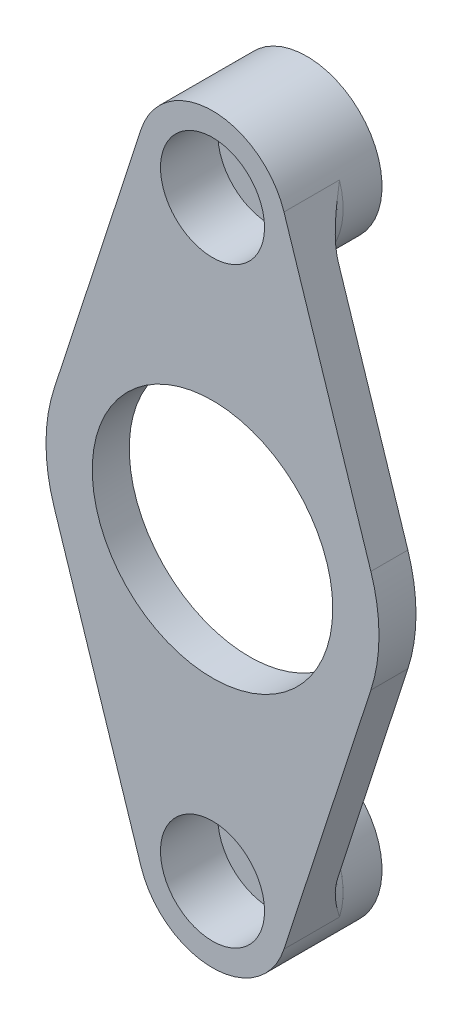
ISO-10303-21;
HEADER;
FILE_DESCRIPTION(('STEP AP214'),'2;1');
FILE_NAME('part.step','',(''),(''),'','','');
FILE_SCHEMA(('AUTOMOTIVE_DESIGN { 1 0 10303 214 1 1 1 1 }'));
ENDSEC;
DATA;
#1=APPLICATION_CONTEXT('core data for automotive mechanical design processes');
#2=APPLICATION_PROTOCOL_DEFINITION('international standard','automotive_design',2000,#1);
#3=PRODUCT_CONTEXT('',#1,'mechanical');
#4=PRODUCT('Part','Part','',(#3));
#5=PRODUCT_RELATED_PRODUCT_CATEGORY('part','',(#4));
#6=PRODUCT_DEFINITION_FORMATION('','',#4);
#7=PRODUCT_DEFINITION_CONTEXT('part definition',#1,'design');
#8=PRODUCT_DEFINITION('design','',#6,#7);
#9=PRODUCT_DEFINITION_SHAPE('','',#8);
#10=(LENGTH_UNIT() NAMED_UNIT(*) SI_UNIT(.MILLI.,.METRE.));
#11=(NAMED_UNIT(*) PLANE_ANGLE_UNIT() SI_UNIT($,.RADIAN.));
#12=(NAMED_UNIT(*) SI_UNIT($,.STERADIAN.) SOLID_ANGLE_UNIT());
#13=UNCERTAINTY_MEASURE_WITH_UNIT(LENGTH_MEASURE(1.E-05),#10,'distance_accuracy_value','');
#14=(GEOMETRIC_REPRESENTATION_CONTEXT(3) GLOBAL_UNCERTAINTY_ASSIGNED_CONTEXT((#13)) GLOBAL_UNIT_ASSIGNED_CONTEXT((#10,
#11,#12)) REPRESENTATION_CONTEXT('',''));
#15=CARTESIAN_POINT('',(0.,0.,0.));
#16=DIRECTION('',(0.,0.,1.));
#17=DIRECTION('',(1.,0.,0.));
#18=AXIS2_PLACEMENT_3D('',#15,#16,#17);
#19=CARTESIAN_POINT('',(0.,20.32,2.54));
#20=DIRECTION('',(0.,0.,1.));
#21=DIRECTION('',(1.,0.,0.));
#22=AXIS2_PLACEMENT_3D('',#19,#20,#21);
#23=PLANE('',#22);
#24=DIRECTION('',(0.30859375,-0.951193932624119,0.));
#25=VECTOR('',#24,1.);
#26=CARTESIAN_POINT('',(-4.90756619613257,-21.9121508789063,2.54));
#27=LINE('',#26,#25);
#28=CARTESIAN_POINT('',(-10.8721466498937,-3.52722656249999,2.54));
#29=VERTEX_POINT('',#28);
#30=CARTESIAN_POINT('',(-4.90756619613257,-21.9121508789063,2.54));
#31=VERTEX_POINT('',#30);
#32=EDGE_CURVE('E295',#29,#31,#27,.T.);
#33=ORIENTED_EDGE('',*,*,#32,.T.);
#34=CARTESIAN_POINT('',(0.,-20.32,2.54));
#35=DIRECTION('',(0.,0.,1.));
#36=DIRECTION('',(-1.,0.,0.));
#37=AXIS2_PLACEMENT_3D('',#34,#35,#36);
#38=CIRCLE('',#37,5.159375);
#39=CARTESIAN_POINT('',(4.90756619613257,-21.9121508789063,2.54));
#40=VERTEX_POINT('',#39);
#41=EDGE_CURVE('E292',#31,#40,#38,.T.);
#42=ORIENTED_EDGE('',*,*,#41,.T.);
#43=DIRECTION('',(0.30859375,0.951193932624119,0.));
#44=VECTOR('',#43,1.);
#45=CARTESIAN_POINT('',(4.90756619613257,-21.9121508789063,2.54));
#46=LINE('',#45,#44);
#47=CARTESIAN_POINT('',(10.8721466498937,-3.5272265625,2.54));
#48=VERTEX_POINT('',#47);
#49=EDGE_CURVE('E289',#40,#48,#46,.T.);
#50=ORIENTED_EDGE('',*,*,#49,.T.);
#51=CARTESIAN_POINT('',(0.,0.,2.54));
#52=DIRECTION('',(0.,0.,1.));
#53=DIRECTION('',(1.,0.,0.));
#54=AXIS2_PLACEMENT_3D('',#51,#52,#53);
#55=CIRCLE('',#54,11.43);
#56=CARTESIAN_POINT('',(10.8721466498937,3.5272265625,2.54));
#57=VERTEX_POINT('',#56);
#58=EDGE_CURVE('E286',#48,#57,#55,.T.);
#59=ORIENTED_EDGE('',*,*,#58,.T.);
#60=DIRECTION('',(-0.30859375,0.951193932624119,0.));
#61=VECTOR('',#60,1.);
#62=CARTESIAN_POINT('',(4.90756619613257,21.9121508789063,2.54));
#63=LINE('',#62,#61);
#64=CARTESIAN_POINT('',(4.90756619613257,21.9121508789063,2.54));
#65=VERTEX_POINT('',#64);
#66=EDGE_CURVE('E139',#57,#65,#63,.T.);
#67=ORIENTED_EDGE('',*,*,#66,.T.);
#68=CARTESIAN_POINT('',(0.,20.32,2.54));
#69=DIRECTION('',(0.,0.,1.));
#70=DIRECTION('',(1.,0.,0.));
#71=AXIS2_PLACEMENT_3D('',#68,#69,#70);
#72=CIRCLE('',#71,5.159375);
#73=CARTESIAN_POINT('',(-4.90756619613257,21.9121508789063,2.54));
#74=VERTEX_POINT('',#73);
#75=EDGE_CURVE('E135',#65,#74,#72,.T.);
#76=ORIENTED_EDGE('',*,*,#75,.T.);
#77=DIRECTION('',(-0.30859375,-0.951193932624119,0.));
#78=VECTOR('',#77,1.);
#79=CARTESIAN_POINT('',(-4.90756619613257,21.9121508789063,2.54));
#80=LINE('',#79,#78);
#81=CARTESIAN_POINT('',(-10.8721466498937,3.5272265625,2.54));
#82=VERTEX_POINT('',#81);
#83=EDGE_CURVE('E126',#74,#82,#80,.T.);
#84=ORIENTED_EDGE('',*,*,#83,.T.);
#85=CARTESIAN_POINT('',(0.,0.,2.54));
#86=DIRECTION('',(0.,0.,1.));
#87=DIRECTION('',(1.,0.,0.));
#88=AXIS2_PLACEMENT_3D('',#85,#86,#87);
#89=CIRCLE('',#88,11.43);
#90=EDGE_CURVE('E134',#82,#29,#89,.T.);
#91=ORIENTED_EDGE('',*,*,#90,.T.);
#92=EDGE_LOOP('',(#33,#42,#50,#59,#67,#76,#84,#91));
#93=FACE_BOUND('',#92,.T.);
#94=CARTESIAN_POINT('',(0.,0.,2.54));
#95=DIRECTION('',(0.,0.,1.));
#96=DIRECTION('',(1.,0.,0.));
#97=AXIS2_PLACEMENT_3D('',#94,#95,#96);
#98=CIRCLE('',#97,8.255);
#99=CARTESIAN_POINT('',(8.255,0.,2.54));
#100=VERTEX_POINT('',#99);
#101=EDGE_CURVE('E301',#100,#100,#98,.T.);
#102=ORIENTED_EDGE('',*,*,#101,.F.);
#103=EDGE_LOOP('',(#102));
#104=FACE_BOUND('',#103,.T.);
#105=CARTESIAN_POINT('',(0.,20.32,2.54));
#106=DIRECTION('',(0.,0.,1.));
#107=DIRECTION('',(1.,0.,0.));
#108=AXIS2_PLACEMENT_3D('',#105,#106,#107);
#109=CIRCLE('',#108,3.571875);
#110=CARTESIAN_POINT('',(3.571875,20.32,2.54));
#111=VERTEX_POINT('',#110);
#112=EDGE_CURVE('E311',#111,#111,#109,.T.);
#113=ORIENTED_EDGE('',*,*,#112,.F.);
#114=EDGE_LOOP('',(#113));
#115=FACE_BOUND('',#114,.T.);
#116=CARTESIAN_POINT('',(0.,-20.32,2.54));
#117=DIRECTION('',(0.,0.,1.));
#118=DIRECTION('',(1.,0.,0.));
#119=AXIS2_PLACEMENT_3D('',#116,#117,#118);
#120=CIRCLE('',#119,3.571875);
#121=CARTESIAN_POINT('',(3.571875,-20.32,2.54));
#122=VERTEX_POINT('',#121);
#123=EDGE_CURVE('E317',#122,#122,#120,.T.);
#124=ORIENTED_EDGE('',*,*,#123,.F.);
#125=EDGE_LOOP('',(#124));
#126=FACE_BOUND('',#125,.T.);
#127=ADVANCED_FACE('F44',(#93,#104,#115,#126),#23,.T.);
#128=CARTESIAN_POINT('',(0.,20.32,0.));
#129=DIRECTION('',(0.,0.,1.));
#130=DIRECTION('',(1.,0.,0.));
#131=AXIS2_PLACEMENT_3D('',#128,#129,#130);
#132=PLANE('',#131);
#133=DIRECTION('',(0.30859375,0.951193932624119,0.));
#134=VECTOR('',#133,1.);
#135=CARTESIAN_POINT('',(4.90756619613257,-21.9121508789063,0.));
#136=LINE('',#135,#134);
#137=CARTESIAN_POINT('',(6.09144510485399,-18.263021773286,0.));
#138=VERTEX_POINT('',#137);
#139=CARTESIAN_POINT('',(10.8721466498937,-3.5272265625,0.));
#140=VERTEX_POINT('',#139);
#141=EDGE_CURVE('E236',#138,#140,#136,.T.);
#142=ORIENTED_EDGE('',*,*,#141,.F.);
#143=CARTESIAN_POINT('',(0.,-20.32,0.));
#144=DIRECTION('',(0.,0.,1.));
#145=DIRECTION('',(1.,0.,0.));
#146=AXIS2_PLACEMENT_3D('',#143,#144,#145);
#147=CIRCLE('',#146,6.429375);
#148=CARTESIAN_POINT('',(-6.09144510485399,-18.263021773286,0.));
#149=VERTEX_POINT('',#148);
#150=EDGE_CURVE('E154',#138,#149,#147,.T.);
#151=ORIENTED_EDGE('',*,*,#150,.T.);
#152=DIRECTION('',(0.30859375,-0.951193932624119,0.));
#153=VECTOR('',#152,1.);
#154=CARTESIAN_POINT('',(-4.90756619613257,-21.9121508789063,0.));
#155=LINE('',#154,#153);
#156=CARTESIAN_POINT('',(-10.8721466498937,-3.52722656249999,0.));
#157=VERTEX_POINT('',#156);
#158=EDGE_CURVE('E250',#157,#149,#155,.T.);
#159=ORIENTED_EDGE('',*,*,#158,.F.);
#160=CARTESIAN_POINT('',(0.,0.,0.));
#161=DIRECTION('',(0.,0.,1.));
#162=DIRECTION('',(1.,0.,0.));
#163=AXIS2_PLACEMENT_3D('',#160,#161,#162);
#164=CIRCLE('',#163,11.43);
#165=CARTESIAN_POINT('',(-10.8721466498937,3.5272265625,0.));
#166=VERTEX_POINT('',#165);
#167=EDGE_CURVE('E260',#166,#157,#164,.T.);
#168=ORIENTED_EDGE('',*,*,#167,.F.);
#169=DIRECTION('',(-0.30859375,-0.951193932624119,0.));
#170=VECTOR('',#169,1.);
#171=CARTESIAN_POINT('',(-4.90756619613257,21.9121508789063,0.));
#172=LINE('',#171,#170);
#173=CARTESIAN_POINT('',(-6.09144510485399,18.263021773286,0.));
#174=VERTEX_POINT('',#173);
#175=EDGE_CURVE('E263',#174,#166,#172,.T.);
#176=ORIENTED_EDGE('',*,*,#175,.F.);
#177=CARTESIAN_POINT('',(0.,20.32,0.));
#178=DIRECTION('',(0.,0.,1.));
#179=DIRECTION('',(1.,0.,0.));
#180=AXIS2_PLACEMENT_3D('',#177,#178,#179);
#181=CIRCLE('',#180,6.429375);
#182=CARTESIAN_POINT('',(6.09144510485399,18.263021773286,0.));
#183=VERTEX_POINT('',#182);
#184=EDGE_CURVE('E149',#174,#183,#181,.T.);
#185=ORIENTED_EDGE('',*,*,#184,.T.);
#186=DIRECTION('',(-0.30859375,0.951193932624119,0.));
#187=VECTOR('',#186,1.);
#188=CARTESIAN_POINT('',(4.90756619613257,21.9121508789063,0.));
#189=LINE('',#188,#187);
#190=CARTESIAN_POINT('',(10.8721466498937,3.5272265625,0.));
#191=VERTEX_POINT('',#190);
#192=EDGE_CURVE('E141',#191,#183,#189,.T.);
#193=ORIENTED_EDGE('',*,*,#192,.F.);
#194=CARTESIAN_POINT('',(0.,0.,0.));
#195=DIRECTION('',(0.,0.,1.));
#196=DIRECTION('',(1.,0.,0.));
#197=AXIS2_PLACEMENT_3D('',#194,#195,#196);
#198=CIRCLE('',#197,11.43);
#199=EDGE_CURVE('E248',#140,#191,#198,.T.);
#200=ORIENTED_EDGE('',*,*,#199,.F.);
#201=EDGE_LOOP('',(#142,#151,#159,#168,#176,#185,#193,#200));
#202=FACE_BOUND('',#201,.T.);
#203=CARTESIAN_POINT('',(0.,0.,0.));
#204=DIRECTION('',(0.,0.,1.));
#205=DIRECTION('',(1.,0.,0.));
#206=AXIS2_PLACEMENT_3D('',#203,#204,#205);
#207=CIRCLE('',#206,8.255);
#208=CARTESIAN_POINT('',(8.255,0.,0.));
#209=VERTEX_POINT('',#208);
#210=EDGE_CURVE('E305',#209,#209,#207,.T.);
#211=ORIENTED_EDGE('',*,*,#210,.T.);
#212=EDGE_LOOP('',(#211));
#213=FACE_BOUND('',#212,.T.);
#214=ADVANCED_FACE('F196',(#202,#213),#132,.F.);
#215=CARTESIAN_POINT('',(0.,20.32,2.54));
#216=DIRECTION('',(0.,0.,-1.));
#217=DIRECTION('',(-1.,0.,0.));
#218=AXIS2_PLACEMENT_3D('',#215,#216,#217);
#219=CYLINDRICAL_SURFACE('',#218,5.159375);
#220=DIRECTION('',(0.,0.,-1.));
#221=VECTOR('',#220,1.);
#222=CARTESIAN_POINT('',(4.90756619613257,21.9121508789063,2.54));
#223=LINE('',#222,#221);
#224=CARTESIAN_POINT('',(4.90756619613257,21.9121508789063,-1.27));
#225=VERTEX_POINT('',#224);
#226=EDGE_CURVE('E66',#65,#225,#223,.T.);
#227=ORIENTED_EDGE('',*,*,#226,.T.);
#228=CARTESIAN_POINT('',(0.,20.32,-1.27));
#229=DIRECTION('',(0.,0.,1.));
#230=DIRECTION('',(1.,0.,0.));
#231=AXIS2_PLACEMENT_3D('',#228,#229,#230);
#232=CIRCLE('',#231,5.159375);
#233=CARTESIAN_POINT('',(-4.90756619613257,21.9121508789063,-1.27));
#234=VERTEX_POINT('',#233);
#235=EDGE_CURVE('E146',#225,#234,#232,.F.);
#236=ORIENTED_EDGE('',*,*,#235,.T.);
#237=DIRECTION('',(0.,0.,-1.));
#238=VECTOR('',#237,1.);
#239=CARTESIAN_POINT('',(-4.90756619613257,21.9121508789063,2.54));
#240=LINE('',#239,#238);
#241=EDGE_CURVE('E73',#74,#234,#240,.T.);
#242=ORIENTED_EDGE('',*,*,#241,.F.);
#243=ORIENTED_EDGE('',*,*,#75,.F.);
#244=EDGE_LOOP('',(#227,#236,#242,#243));
#245=FACE_BOUND('',#244,.T.);
#246=CARTESIAN_POINT('',(0.,20.32,-3.937));
#247=DIRECTION('',(0.,0.,-1.));
#248=DIRECTION('',(-1.,0.,0.));
#249=AXIS2_PLACEMENT_3D('',#246,#247,#248);
#250=CIRCLE('',#249,5.159375);
#251=CARTESIAN_POINT('',(-5.159375,20.32,-3.937));
#252=VERTEX_POINT('',#251);
#253=EDGE_CURVE('E329',#252,#252,#250,.T.);
#254=ORIENTED_EDGE('',*,*,#253,.F.);
#255=EDGE_LOOP('',(#254));
#256=FACE_BOUND('',#255,.T.);
#257=ADVANCED_FACE('F143',(#245,#256),#219,.T.);
#258=CARTESIAN_POINT('',(-4.90756619613257,21.9121508789063,2.54));
#259=DIRECTION('',(0.951193932624119,-0.30859375,0.));
#260=DIRECTION('',(0.30859375,0.951193932624119,0.));
#261=AXIS2_PLACEMENT_3D('',#258,#259,#260);
#262=PLANE('',#261);
#263=ORIENTED_EDGE('',*,*,#241,.T.);
#264=CARTESIAN_POINT('',(-6.09144510485399,18.263021773286,0.));
#265=CARTESIAN_POINT('',(-6.0704484104297,18.3277409334815,-6.12227770285752E-06));
#266=CARTESIAN_POINT('',(-6.04945996461203,18.3924346685846,-0.00194589060258587));
#267=CARTESIAN_POINT('',(-6.00755314453848,18.5216061537152,-0.00933745959900681));
#268=CARTESIAN_POINT('',(-5.98663473712258,18.5860840059535,-0.014787254858983));
#269=CARTESIAN_POINT('',(-5.92415744801483,18.7786608754659,-0.0358297203538431));
#270=CARTESIAN_POINT('',(-5.88274671097055,18.9063032590917,-0.0561199252970768));
#271=CARTESIAN_POINT('',(-5.80107411538737,19.1580467807294,-0.106560753792625));
#272=CARTESIAN_POINT('',(-5.76080433738759,19.2821723292912,-0.136582007787581));
#273=CARTESIAN_POINT('',(-5.68089418872827,19.5284833727256,-0.204714854919983));
#274=CARTESIAN_POINT('',(-5.64125438950335,19.6506671062367,-0.242833387696398));
#275=CARTESIAN_POINT('',(-5.54226774064682,19.9557785992696,-0.346975404471301));
#276=CARTESIAN_POINT('',(-5.48334794226813,20.1373900373796,-0.417226081712979));
#277=CARTESIAN_POINT('',(-5.36680567364506,20.4966140942781,-0.568056186074146));
#278=CARTESIAN_POINT('',(-5.30918335429405,20.6742262479604,-0.648636807319314));
#279=CARTESIAN_POINT('',(-5.13726611026418,21.2041353580272,-0.900781076949796));
#280=CARTESIAN_POINT('',(-5.02437541507473,21.5521039877027,-1.08220186798079));
#281=CARTESIAN_POINT('',(-4.91021370776092,21.9039903215474,-1.26574350008352));
#282=CARTESIAN_POINT('',(-4.90888994978164,21.9080706069005,-1.2678717611417));
#283=CARTESIAN_POINT('',(-4.90756619613257,21.9121508789063,-1.27));
#284=B_SPLINE_CURVE_WITH_KNOTS('',3,(#264,#265,#266,#267,#268,#269,#270,#271,#272,#273,#274,
#275,#276,#277,#278,#279,#280,#281,#282,#283),.UNSPECIFIED.,.F.,.F.,(4,2,2,2,2,2,2,2,2,4),(0.,
0.204050191628768,0.407983904934214,0.814594975242788,1.21600801094313,1.61776646913629,
2.22761688273028,2.83753785777503,4.06207716751907,4.07644292555272),.UNSPECIFIED.);
#285=EDGE_CURVE('E11',#234,#174,#284,.F.);
#286=ORIENTED_EDGE('',*,*,#285,.T.);
#287=ORIENTED_EDGE('',*,*,#175,.T.);
#288=DIRECTION('',(0.,0.,-1.));
#289=VECTOR('',#288,1.);
#290=CARTESIAN_POINT('',(-10.8721466498937,3.5272265625,2.54));
#291=LINE('',#290,#289);
#292=EDGE_CURVE('E130',#82,#166,#291,.T.);
#293=ORIENTED_EDGE('',*,*,#292,.F.);
#294=ORIENTED_EDGE('',*,*,#83,.F.);
#295=EDGE_LOOP('',(#263,#286,#287,#293,#294));
#296=FACE_BOUND('',#295,.T.);
#297=ADVANCED_FACE('F128',(#296),#262,.F.);
#298=CARTESIAN_POINT('',(0.,0.,2.54));
#299=DIRECTION('',(0.,0.,-1.));
#300=DIRECTION('',(-1.,0.,0.));
#301=AXIS2_PLACEMENT_3D('',#298,#299,#300);
#302=CYLINDRICAL_SURFACE('',#301,11.43);
#303=ORIENTED_EDGE('',*,*,#167,.T.);
#304=DIRECTION('',(0.,0.,-1.));
#305=VECTOR('',#304,1.);
#306=CARTESIAN_POINT('',(-10.8721466498937,-3.52722656249999,2.54));
#307=LINE('',#306,#305);
#308=EDGE_CURVE('E156',#29,#157,#307,.T.);
#309=ORIENTED_EDGE('',*,*,#308,.F.);
#310=ORIENTED_EDGE('',*,*,#90,.F.);
#311=ORIENTED_EDGE('',*,*,#292,.T.);
#312=EDGE_LOOP('',(#303,#309,#310,#311));
#313=FACE_BOUND('',#312,.T.);
#314=ADVANCED_FACE('F199',(#313),#302,.T.);
#315=CARTESIAN_POINT('',(-4.90756619613257,-21.9121508789063,2.54));
#316=DIRECTION('',(0.951193932624119,0.30859375,0.));
#317=DIRECTION('',(-0.30859375,0.951193932624119,0.));
#318=AXIS2_PLACEMENT_3D('',#315,#316,#317);
#319=PLANE('',#318);
#320=ORIENTED_EDGE('',*,*,#158,.T.);
#321=CARTESIAN_POINT('',(-6.09144510485399,-18.263021773286,0.));
#322=CARTESIAN_POINT('',(-6.0704484104297,-18.3277409334815,-6.12227770285752E-06));
#323=CARTESIAN_POINT('',(-6.04945996461203,-18.3924346685846,-0.00194589060258587));
#324=CARTESIAN_POINT('',(-6.00755314453848,-18.5216061537152,-0.00933745959900681));
#325=CARTESIAN_POINT('',(-5.98663473712258,-18.5860840059535,-0.014787254858983));
#326=CARTESIAN_POINT('',(-5.92415744801483,-18.7786608754659,-0.0358297203538431));
#327=CARTESIAN_POINT('',(-5.88274671097055,-18.9063032590917,-0.0561199252970768));
#328=CARTESIAN_POINT('',(-5.80107411538737,-19.1580467807294,-0.106560753792625));
#329=CARTESIAN_POINT('',(-5.76080433738759,-19.2821723292912,-0.136582007787581));
#330=CARTESIAN_POINT('',(-5.68089418872827,-19.5284833727256,-0.204714854919983));
#331=CARTESIAN_POINT('',(-5.64125438950335,-19.6506671062367,-0.242833387696398));
#332=CARTESIAN_POINT('',(-5.54226774064682,-19.9557785992696,-0.346975404471301));
#333=CARTESIAN_POINT('',(-5.48334794226813,-20.1373900373796,-0.417226081712979));
#334=CARTESIAN_POINT('',(-5.36680567364506,-20.4966140942781,-0.568056186074146));
#335=CARTESIAN_POINT('',(-5.30918335429405,-20.6742262479604,-0.648636807319314));
#336=CARTESIAN_POINT('',(-5.13726611026418,-21.2041353580272,-0.900781076949796));
#337=CARTESIAN_POINT('',(-5.02437541507473,-21.5521039877027,-1.08220186798079));
#338=CARTESIAN_POINT('',(-4.91021370776092,-21.9039903215474,-1.26574350008352));
#339=CARTESIAN_POINT('',(-4.90888994978164,-21.9080706069005,-1.2678717611417));
#340=CARTESIAN_POINT('',(-4.90756619613257,-21.9121508789063,-1.27));
#341=B_SPLINE_CURVE_WITH_KNOTS('',3,(#321,#322,#323,#324,#325,#326,#327,#328,#329,#330,#331,
#332,#333,#334,#335,#336,#337,#338,#339,#340),.UNSPECIFIED.,.F.,.F.,(4,2,2,2,2,2,2,2,2,4),(0.,
0.204050191628768,0.407983904934214,0.814594975242788,1.21600801094313,1.61776646913629,
2.22761688273028,2.83753785777503,4.06207716751907,4.07644292555272),.UNSPECIFIED.);
#342=CARTESIAN_POINT('',(-4.90756619613257,-21.9121508789063,-1.27));
#343=VERTEX_POINT('',#342);
#344=EDGE_CURVE('E169',#149,#343,#341,.T.);
#345=ORIENTED_EDGE('',*,*,#344,.T.);
#346=DIRECTION('',(0.,0.,-1.));
#347=VECTOR('',#346,1.);
#348=CARTESIAN_POINT('',(-4.90756619613257,-21.9121508789063,2.54));
#349=LINE('',#348,#347);
#350=EDGE_CURVE('E254',#31,#343,#349,.T.);
#351=ORIENTED_EDGE('',*,*,#350,.F.);
#352=ORIENTED_EDGE('',*,*,#32,.F.);
#353=ORIENTED_EDGE('',*,*,#308,.T.);
#354=EDGE_LOOP('',(#320,#345,#351,#352,#353));
#355=FACE_BOUND('',#354,.T.);
#356=ADVANCED_FACE('F184',(#355),#319,.F.);
#357=CARTESIAN_POINT('',(0.,-20.32,2.54));
#358=DIRECTION('',(0.,0.,-1.));
#359=DIRECTION('',(-1.,0.,0.));
#360=AXIS2_PLACEMENT_3D('',#357,#358,#359);
#361=CYLINDRICAL_SURFACE('',#360,5.159375);
#362=ORIENTED_EDGE('',*,*,#350,.T.);
#363=CARTESIAN_POINT('',(0.,-20.32,-1.27));
#364=DIRECTION('',(0.,0.,1.));
#365=DIRECTION('',(1.,0.,0.));
#366=AXIS2_PLACEMENT_3D('',#363,#364,#365);
#367=CIRCLE('',#366,5.159375);
#368=CARTESIAN_POINT('',(4.90756619613257,-21.9121508789063,-1.27));
#369=VERTEX_POINT('',#368);
#370=EDGE_CURVE('E163',#343,#369,#367,.F.);
#371=ORIENTED_EDGE('',*,*,#370,.T.);
#372=DIRECTION('',(0.,0.,-1.));
#373=VECTOR('',#372,1.);
#374=CARTESIAN_POINT('',(4.90756619613257,-21.9121508789063,2.54));
#375=LINE('',#374,#373);
#376=EDGE_CURVE('E240',#40,#369,#375,.T.);
#377=ORIENTED_EDGE('',*,*,#376,.F.);
#378=ORIENTED_EDGE('',*,*,#41,.F.);
#379=EDGE_LOOP('',(#362,#371,#377,#378));
#380=FACE_BOUND('',#379,.T.);
#381=CARTESIAN_POINT('',(0.,-20.32,-3.937));
#382=DIRECTION('',(0.,0.,-1.));
#383=DIRECTION('',(-1.,0.,0.));
#384=AXIS2_PLACEMENT_3D('',#381,#382,#383);
#385=CIRCLE('',#384,5.159375);
#386=CARTESIAN_POINT('',(-5.159375,-20.32,-3.937));
#387=VERTEX_POINT('',#386);
#388=EDGE_CURVE('E333',#387,#387,#385,.T.);
#389=ORIENTED_EDGE('',*,*,#388,.F.);
#390=EDGE_LOOP('',(#389));
#391=FACE_BOUND('',#390,.T.);
#392=ADVANCED_FACE('F205',(#380,#391),#361,.T.);
#393=CARTESIAN_POINT('',(4.90756619613257,-21.9121508789063,2.54));
#394=DIRECTION('',(-0.951193932624119,0.30859375,0.));
#395=DIRECTION('',(-0.30859375,-0.951193932624119,0.));
#396=AXIS2_PLACEMENT_3D('',#393,#394,#395);
#397=PLANE('',#396);
#398=ORIENTED_EDGE('',*,*,#376,.T.);
#399=CARTESIAN_POINT('',(6.09144510485399,-18.263021773286,0.));
#400=CARTESIAN_POINT('',(6.0704484104297,-18.3277409334815,-6.12227770285752E-06));
#401=CARTESIAN_POINT('',(6.04945996461203,-18.3924346685846,-0.00194589060258587));
#402=CARTESIAN_POINT('',(6.00755314453848,-18.5216061537152,-0.00933745959900681));
#403=CARTESIAN_POINT('',(5.98663473712258,-18.5860840059535,-0.014787254858983));
#404=CARTESIAN_POINT('',(5.92415744801483,-18.7786608754659,-0.0358297203538431));
#405=CARTESIAN_POINT('',(5.88274671097055,-18.9063032590917,-0.0561199252970768));
#406=CARTESIAN_POINT('',(5.80107411538737,-19.1580467807294,-0.106560753792625));
#407=CARTESIAN_POINT('',(5.76080433738759,-19.2821723292912,-0.136582007787581));
#408=CARTESIAN_POINT('',(5.68089418872827,-19.5284833727256,-0.204714854919983));
#409=CARTESIAN_POINT('',(5.64125438950335,-19.6506671062367,-0.242833387696398));
#410=CARTESIAN_POINT('',(5.54226774064682,-19.9557785992696,-0.346975404471301));
#411=CARTESIAN_POINT('',(5.48334794226813,-20.1373900373796,-0.417226081712979));
#412=CARTESIAN_POINT('',(5.36680567364506,-20.4966140942781,-0.568056186074146));
#413=CARTESIAN_POINT('',(5.30918335429405,-20.6742262479604,-0.648636807319314));
#414=CARTESIAN_POINT('',(5.13726611026418,-21.2041353580272,-0.900781076949796));
#415=CARTESIAN_POINT('',(5.02437541507473,-21.5521039877027,-1.08220186798079));
#416=CARTESIAN_POINT('',(4.91021370776092,-21.9039903215474,-1.26574350008352));
#417=CARTESIAN_POINT('',(4.90888994978164,-21.9080706069005,-1.2678717611417));
#418=CARTESIAN_POINT('',(4.90756619613257,-21.9121508789063,-1.27));
#419=B_SPLINE_CURVE_WITH_KNOTS('',3,(#399,#400,#401,#402,#403,#404,#405,#406,#407,#408,#409,
#410,#411,#412,#413,#414,#415,#416,#417,#418),.UNSPECIFIED.,.F.,.F.,(4,2,2,2,2,2,2,2,2,4),(0.,
0.204050191628768,0.407983904934214,0.814594975242788,1.21600801094313,1.61776646913629,
2.22761688273028,2.83753785777503,4.06207716751907,4.07644292555272),.UNSPECIFIED.);
#420=EDGE_CURVE('E178',#369,#138,#419,.F.);
#421=ORIENTED_EDGE('',*,*,#420,.T.);
#422=ORIENTED_EDGE('',*,*,#141,.T.);
#423=DIRECTION('',(0.,0.,-1.));
#424=VECTOR('',#423,1.);
#425=CARTESIAN_POINT('',(10.8721466498937,-3.5272265625,2.54));
#426=LINE('',#425,#424);
#427=EDGE_CURVE('E277',#48,#140,#426,.T.);
#428=ORIENTED_EDGE('',*,*,#427,.F.);
#429=ORIENTED_EDGE('',*,*,#49,.F.);
#430=EDGE_LOOP('',(#398,#421,#422,#428,#429));
#431=FACE_BOUND('',#430,.T.);
#432=ADVANCED_FACE('F234',(#431),#397,.F.);
#433=CARTESIAN_POINT('',(0.,0.,2.54));
#434=DIRECTION('',(0.,0.,-1.));
#435=DIRECTION('',(-1.,0.,0.));
#436=AXIS2_PLACEMENT_3D('',#433,#434,#435);
#437=CYLINDRICAL_SURFACE('',#436,11.43);
#438=ORIENTED_EDGE('',*,*,#199,.T.);
#439=DIRECTION('',(0.,0.,-1.));
#440=VECTOR('',#439,1.);
#441=CARTESIAN_POINT('',(10.8721466498937,3.5272265625,2.54));
#442=LINE('',#441,#440);
#443=EDGE_CURVE('E273',#57,#191,#442,.T.);
#444=ORIENTED_EDGE('',*,*,#443,.F.);
#445=ORIENTED_EDGE('',*,*,#58,.F.);
#446=ORIENTED_EDGE('',*,*,#427,.T.);
#447=EDGE_LOOP('',(#438,#444,#445,#446));
#448=FACE_BOUND('',#447,.T.);
#449=ADVANCED_FACE('F222',(#448),#437,.T.);
#450=CARTESIAN_POINT('',(4.90756619613257,21.9121508789063,2.54));
#451=DIRECTION('',(-0.951193932624119,-0.30859375,0.));
#452=DIRECTION('',(0.30859375,-0.951193932624119,0.));
#453=AXIS2_PLACEMENT_3D('',#450,#451,#452);
#454=PLANE('',#453);
#455=ORIENTED_EDGE('',*,*,#192,.T.);
#456=CARTESIAN_POINT('',(6.09144510485399,18.263021773286,0.));
#457=CARTESIAN_POINT('',(6.0704484104297,18.3277409334815,-6.12227770285752E-06));
#458=CARTESIAN_POINT('',(6.04945996461203,18.3924346685846,-0.00194589060258587));
#459=CARTESIAN_POINT('',(6.00755314453848,18.5216061537152,-0.00933745959900681));
#460=CARTESIAN_POINT('',(5.98663473712258,18.5860840059535,-0.014787254858983));
#461=CARTESIAN_POINT('',(5.92415744801483,18.7786608754659,-0.0358297203538431));
#462=CARTESIAN_POINT('',(5.88274671097055,18.9063032590917,-0.0561199252970768));
#463=CARTESIAN_POINT('',(5.80107411538737,19.1580467807294,-0.106560753792625));
#464=CARTESIAN_POINT('',(5.76080433738759,19.2821723292912,-0.136582007787581));
#465=CARTESIAN_POINT('',(5.68089418872827,19.5284833727256,-0.204714854919983));
#466=CARTESIAN_POINT('',(5.64125438950335,19.6506671062367,-0.242833387696398));
#467=CARTESIAN_POINT('',(5.54226774064682,19.9557785992696,-0.346975404471301));
#468=CARTESIAN_POINT('',(5.48334794226813,20.1373900373796,-0.417226081712979));
#469=CARTESIAN_POINT('',(5.36680567364506,20.4966140942781,-0.568056186074146));
#470=CARTESIAN_POINT('',(5.30918335429405,20.6742262479604,-0.648636807319314));
#471=CARTESIAN_POINT('',(5.13726611026418,21.2041353580272,-0.900781076949796));
#472=CARTESIAN_POINT('',(5.02437541507473,21.5521039877027,-1.08220186798079));
#473=CARTESIAN_POINT('',(4.91021370776092,21.9039903215474,-1.26574350008352));
#474=CARTESIAN_POINT('',(4.90888994978164,21.9080706069005,-1.2678717611417));
#475=CARTESIAN_POINT('',(4.90756619613257,21.9121508789063,-1.27));
#476=B_SPLINE_CURVE_WITH_KNOTS('',3,(#456,#457,#458,#459,#460,#461,#462,#463,#464,#465,#466,
#467,#468,#469,#470,#471,#472,#473,#474,#475),.UNSPECIFIED.,.F.,.F.,(4,2,2,2,2,2,2,2,2,4),(0.,
0.204050191628768,0.407983904934214,0.814594975242788,1.21600801094313,1.61776646913629,
2.22761688273028,2.83753785777503,4.06207716751907,4.07644292555272),.UNSPECIFIED.);
#477=EDGE_CURVE('E59',#183,#225,#476,.T.);
#478=ORIENTED_EDGE('',*,*,#477,.T.);
#479=ORIENTED_EDGE('',*,*,#226,.F.);
#480=ORIENTED_EDGE('',*,*,#66,.F.);
#481=ORIENTED_EDGE('',*,*,#443,.T.);
#482=EDGE_LOOP('',(#455,#478,#479,#480,#481));
#483=FACE_BOUND('',#482,.T.);
#484=ADVANCED_FACE('F218',(#483),#454,.F.);
#485=CARTESIAN_POINT('',(0.,0.,2.54));
#486=DIRECTION('',(0.,0.,-1.));
#487=DIRECTION('',(-1.,0.,0.));
#488=AXIS2_PLACEMENT_3D('',#485,#486,#487);
#489=CYLINDRICAL_SURFACE('',#488,8.255);
#490=ORIENTED_EDGE('',*,*,#101,.T.);
#491=EDGE_LOOP('',(#490));
#492=FACE_BOUND('',#491,.T.);
#493=ORIENTED_EDGE('',*,*,#210,.F.);
#494=EDGE_LOOP('',(#493));
#495=FACE_BOUND('',#494,.T.);
#496=ADVANCED_FACE('F215',(#492,#495),#489,.F.);
#497=CARTESIAN_POINT('',(0.,20.32,2.54));
#498=DIRECTION('',(0.,0.,-1.));
#499=DIRECTION('',(-1.,0.,0.));
#500=AXIS2_PLACEMENT_3D('',#497,#498,#499);
#501=CYLINDRICAL_SURFACE('',#500,3.571875);
#502=ORIENTED_EDGE('',*,*,#112,.T.);
#503=EDGE_LOOP('',(#502));
#504=FACE_BOUND('',#503,.T.);
#505=CARTESIAN_POINT('',(0.,20.32,-1.397));
#506=DIRECTION('',(0.,0.,1.));
#507=DIRECTION('',(1.,0.,0.));
#508=AXIS2_PLACEMENT_3D('',#505,#506,#507);
#509=CIRCLE('',#508,3.571875);
#510=CARTESIAN_POINT('',(3.571875,20.32,-1.397));
#511=VERTEX_POINT('',#510);
#512=EDGE_CURVE('E321',#511,#511,#509,.T.);
#513=ORIENTED_EDGE('',*,*,#512,.F.);
#514=EDGE_LOOP('',(#513));
#515=FACE_BOUND('',#514,.T.);
#516=ADVANCED_FACE('F363',(#504,#515),#501,.F.);
#517=CARTESIAN_POINT('',(0.,-20.32,2.54));
#518=DIRECTION('',(0.,0.,-1.));
#519=DIRECTION('',(-1.,0.,0.));
#520=AXIS2_PLACEMENT_3D('',#517,#518,#519);
#521=CYLINDRICAL_SURFACE('',#520,3.571875);
#522=ORIENTED_EDGE('',*,*,#123,.T.);
#523=EDGE_LOOP('',(#522));
#524=FACE_BOUND('',#523,.T.);
#525=CARTESIAN_POINT('',(0.,-20.32,-1.397));
#526=DIRECTION('',(0.,0.,1.));
#527=DIRECTION('',(-1.,0.,0.));
#528=AXIS2_PLACEMENT_3D('',#525,#526,#527);
#529=CIRCLE('',#528,3.571875);
#530=CARTESIAN_POINT('',(-3.571875,-20.32,-1.397));
#531=VERTEX_POINT('',#530);
#532=EDGE_CURVE('E325',#531,#531,#529,.T.);
#533=ORIENTED_EDGE('',*,*,#532,.F.);
#534=EDGE_LOOP('',(#533));
#535=FACE_BOUND('',#534,.T.);
#536=ADVANCED_FACE('F359',(#524,#535),#521,.F.);
#537=CARTESIAN_POINT('',(0.,20.32,-1.397));
#538=DIRECTION('',(0.,0.,-1.));
#539=DIRECTION('',(-1.,0.,0.));
#540=AXIS2_PLACEMENT_3D('',#537,#538,#539);
#541=PLANE('',#540);
#542=CARTESIAN_POINT('',(0.,20.32,-1.397));
#543=DIRECTION('',(0.,0.,1.));
#544=DIRECTION('',(1.,0.,0.));
#545=AXIS2_PLACEMENT_3D('',#542,#543,#544);
#546=CIRCLE('',#545,1.89865);
#547=CARTESIAN_POINT('',(1.89865,20.32,-1.397));
#548=VERTEX_POINT('',#547);
#549=EDGE_CURVE('E349',#548,#548,#546,.T.);
#550=ORIENTED_EDGE('',*,*,#549,.F.);
#551=EDGE_LOOP('',(#550));
#552=FACE_BOUND('',#551,.T.);
#553=ORIENTED_EDGE('',*,*,#512,.T.);
#554=EDGE_LOOP('',(#553));
#555=FACE_BOUND('',#554,.T.);
#556=ADVANCED_FACE('F355',(#552,#555),#541,.F.);
#557=CARTESIAN_POINT('',(0.,20.32,-3.937));
#558=DIRECTION('',(0.,0.,-1.));
#559=DIRECTION('',(-1.,0.,0.));
#560=AXIS2_PLACEMENT_3D('',#557,#558,#559);
#561=PLANE('',#560);
#562=CARTESIAN_POINT('',(0.,20.32,-3.937));
#563=DIRECTION('',(0.,0.,1.));
#564=DIRECTION('',(1.,0.,0.));
#565=AXIS2_PLACEMENT_3D('',#562,#563,#564);
#566=CIRCLE('',#565,1.89865);
#567=CARTESIAN_POINT('',(1.89865,20.32,-3.937));
#568=VERTEX_POINT('',#567);
#569=EDGE_CURVE('E345',#568,#568,#566,.T.);
#570=ORIENTED_EDGE('',*,*,#569,.T.);
#571=EDGE_LOOP('',(#570));
#572=FACE_BOUND('',#571,.T.);
#573=ORIENTED_EDGE('',*,*,#253,.T.);
#574=EDGE_LOOP('',(#573));
#575=FACE_BOUND('',#574,.T.);
#576=ADVANCED_FACE('F358',(#572,#575),#561,.T.);
#577=CARTESIAN_POINT('',(0.,-20.32,-1.397));
#578=DIRECTION('',(0.,0.,-1.));
#579=DIRECTION('',(-1.,0.,0.));
#580=AXIS2_PLACEMENT_3D('',#577,#578,#579);
#581=PLANE('',#580);
#582=CARTESIAN_POINT('',(0.,-20.32,-1.397));
#583=DIRECTION('',(0.,0.,1.));
#584=DIRECTION('',(1.,0.,0.));
#585=AXIS2_PLACEMENT_3D('',#582,#583,#584);
#586=CIRCLE('',#585,1.89865);
#587=CARTESIAN_POINT('',(1.89865,-20.32,-1.397));
#588=VERTEX_POINT('',#587);
#589=EDGE_CURVE('E341',#588,#588,#586,.T.);
#590=ORIENTED_EDGE('',*,*,#589,.F.);
#591=EDGE_LOOP('',(#590));
#592=FACE_BOUND('',#591,.T.);
#593=ORIENTED_EDGE('',*,*,#532,.T.);
#594=EDGE_LOOP('',(#593));
#595=FACE_BOUND('',#594,.T.);
#596=ADVANCED_FACE('F375',(#592,#595),#581,.F.);
#597=CARTESIAN_POINT('',(0.,-20.32,-3.937));
#598=DIRECTION('',(0.,0.,-1.));
#599=DIRECTION('',(-1.,0.,0.));
#600=AXIS2_PLACEMENT_3D('',#597,#598,#599);
#601=PLANE('',#600);
#602=CARTESIAN_POINT('',(0.,-20.32,-3.937));
#603=DIRECTION('',(0.,0.,1.));
#604=DIRECTION('',(1.,0.,0.));
#605=AXIS2_PLACEMENT_3D('',#602,#603,#604);
#606=CIRCLE('',#605,1.89865);
#607=CARTESIAN_POINT('',(1.89865,-20.32,-3.937));
#608=VERTEX_POINT('',#607);
#609=EDGE_CURVE('E337',#608,#608,#606,.T.);
#610=ORIENTED_EDGE('',*,*,#609,.T.);
#611=EDGE_LOOP('',(#610));
#612=FACE_BOUND('',#611,.T.);
#613=ORIENTED_EDGE('',*,*,#388,.T.);
#614=EDGE_LOOP('',(#613));
#615=FACE_BOUND('',#614,.T.);
#616=ADVANCED_FACE('F379',(#612,#615),#601,.T.);
#617=CARTESIAN_POINT('',(0.,-20.32,-1.397));
#618=DIRECTION('',(0.,0.,1.));
#619=DIRECTION('',(1.,0.,0.));
#620=AXIS2_PLACEMENT_3D('',#617,#618,#619);
#621=CYLINDRICAL_SURFACE('',#620,1.89865);
#622=ORIENTED_EDGE('',*,*,#609,.F.);
#623=EDGE_LOOP('',(#622));
#624=FACE_BOUND('',#623,.T.);
#625=ORIENTED_EDGE('',*,*,#589,.T.);
#626=EDGE_LOOP('',(#625));
#627=FACE_BOUND('',#626,.T.);
#628=ADVANCED_FACE('F383',(#624,#627),#621,.F.);
#629=CARTESIAN_POINT('',(0.,20.32,-1.397));
#630=DIRECTION('',(0.,0.,1.));
#631=DIRECTION('',(1.,0.,0.));
#632=AXIS2_PLACEMENT_3D('',#629,#630,#631);
#633=CYLINDRICAL_SURFACE('',#632,1.89865);
#634=ORIENTED_EDGE('',*,*,#569,.F.);
#635=EDGE_LOOP('',(#634));
#636=FACE_BOUND('',#635,.T.);
#637=ORIENTED_EDGE('',*,*,#549,.T.);
#638=EDGE_LOOP('',(#637));
#639=FACE_BOUND('',#638,.T.);
#640=ADVANCED_FACE('F192',(#636,#639),#633,.F.);
#641=CARTESIAN_POINT('',(0.,-20.32,-1.27));
#642=DIRECTION('',(0.,0.,1.));
#643=DIRECTION('',(1.,0.,0.));
#644=AXIS2_PLACEMENT_3D('',#641,#642,#643);
#645=TOROIDAL_SURFACE('',#644,6.429375,1.27);
#646=ORIENTED_EDGE('',*,*,#420,.F.);
#647=ORIENTED_EDGE('',*,*,#370,.F.);
#648=ORIENTED_EDGE('',*,*,#344,.F.);
#649=ORIENTED_EDGE('',*,*,#150,.F.);
#650=EDGE_LOOP('',(#646,#647,#648,#649));
#651=FACE_BOUND('',#650,.T.);
#652=ADVANCED_FACE('F188',(#651),#645,.F.);
#653=CARTESIAN_POINT('',(0.,20.32,-1.27));
#654=DIRECTION('',(0.,0.,1.));
#655=DIRECTION('',(1.,0.,0.));
#656=AXIS2_PLACEMENT_3D('',#653,#654,#655);
#657=TOROIDAL_SURFACE('',#656,6.429375,1.27);
#658=ORIENTED_EDGE('',*,*,#285,.F.);
#659=ORIENTED_EDGE('',*,*,#235,.F.);
#660=ORIENTED_EDGE('',*,*,#477,.F.);
#661=ORIENTED_EDGE('',*,*,#184,.F.);
#662=EDGE_LOOP('',(#658,#659,#660,#661));
#663=FACE_BOUND('',#662,.T.);
#664=ADVANCED_FACE('F46',(#663),#657,.F.);
#665=CLOSED_SHELL('',(#127,#214,#257,#297,#314,#356,#392,#432,#449,#484,#496,#516,#536,#556,
#576,#596,#616,#628,#640,#652,#664));
#666=MANIFOLD_SOLID_BREP('B2',#665);
#667=ADVANCED_BREP_SHAPE_REPRESENTATION('',(#18,#666),#14);
#668=SHAPE_DEFINITION_REPRESENTATION(#9,#667);
ENDSEC;
END-ISO-10303-21;
